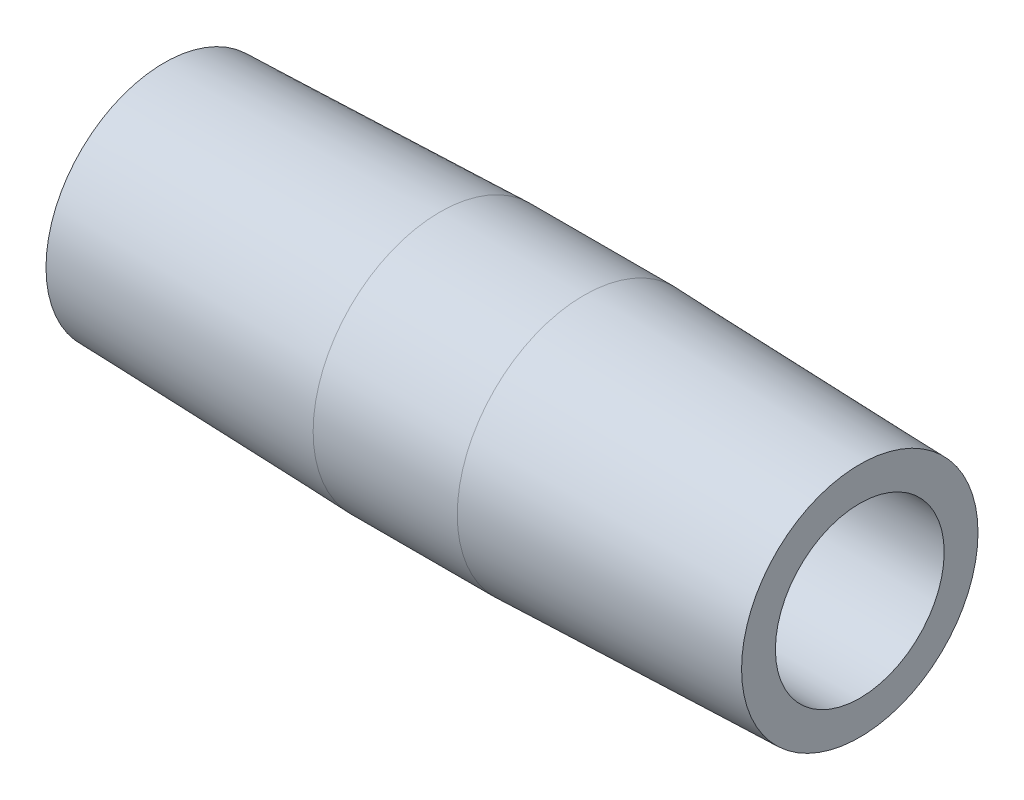
ISO-10303-21;
HEADER;
FILE_DESCRIPTION(('STEP AP214'),'2;1');
FILE_NAME('part.step','',(''),(''),'','','');
FILE_SCHEMA(('AUTOMOTIVE_DESIGN { 1 0 10303 214 1 1 1 1 }'));
ENDSEC;
DATA;
#1=APPLICATION_CONTEXT('core data for automotive mechanical design processes');
#2=APPLICATION_PROTOCOL_DEFINITION('international standard','automotive_design',2000,#1);
#3=PRODUCT_CONTEXT('',#1,'mechanical');
#4=PRODUCT('Part','Part','',(#3));
#5=PRODUCT_RELATED_PRODUCT_CATEGORY('part','',(#4));
#6=PRODUCT_DEFINITION_FORMATION('','',#4);
#7=PRODUCT_DEFINITION_CONTEXT('part definition',#1,'design');
#8=PRODUCT_DEFINITION('design','',#6,#7);
#9=PRODUCT_DEFINITION_SHAPE('','',#8);
#10=(LENGTH_UNIT() NAMED_UNIT(*) SI_UNIT(.MILLI.,.METRE.));
#11=(NAMED_UNIT(*) PLANE_ANGLE_UNIT() SI_UNIT($,.RADIAN.));
#12=(NAMED_UNIT(*) SI_UNIT($,.STERADIAN.) SOLID_ANGLE_UNIT());
#13=UNCERTAINTY_MEASURE_WITH_UNIT(LENGTH_MEASURE(1.E-05),#10,'distance_accuracy_value','');
#14=(GEOMETRIC_REPRESENTATION_CONTEXT(3) GLOBAL_UNCERTAINTY_ASSIGNED_CONTEXT((#13)) GLOBAL_UNIT_ASSIGNED_CONTEXT((#10,
#11,#12)) REPRESENTATION_CONTEXT('',''));
#15=CARTESIAN_POINT('',(0.,0.,0.));
#16=DIRECTION('',(0.,0.,1.));
#17=DIRECTION('',(1.,0.,0.));
#18=AXIS2_PLACEMENT_3D('',#15,#16,#17);
#19=CARTESIAN_POINT('',(0.,0.,0.));
#20=DIRECTION('',(1.,0.,0.));
#21=DIRECTION('',(0.,0.,-1.));
#22=AXIS2_PLACEMENT_3D('',#19,#20,#21);
#23=CYLINDRICAL_SURFACE('',#22,6.9453125);
#24=CARTESIAN_POINT('',(3.94716000000001,0.,0.));
#25=DIRECTION('',(-1.,0.,0.));
#26=DIRECTION('',(0.,0.,1.));
#27=AXIS2_PLACEMENT_3D('',#24,#25,#26);
#28=CIRCLE('',#27,6.9453125);
#29=CARTESIAN_POINT('',(3.94716000000001,0.,6.9453125));
#30=VERTEX_POINT('',#29);
#31=EDGE_CURVE('E42',#30,#30,#28,.T.);
#32=ORIENTED_EDGE('',*,*,#31,.T.);
#33=EDGE_LOOP('',(#32));
#34=FACE_BOUND('',#33,.T.);
#35=CARTESIAN_POINT('',(-3.94716000000001,0.,0.));
#36=DIRECTION('',(1.,0.,0.));
#37=DIRECTION('',(0.,0.,-1.));
#38=AXIS2_PLACEMENT_3D('',#35,#36,#37);
#39=CIRCLE('',#38,6.9453125);
#40=CARTESIAN_POINT('',(-3.94716000000001,0.,-6.9453125));
#41=VERTEX_POINT('',#40);
#42=EDGE_CURVE('E50',#41,#41,#39,.T.);
#43=ORIENTED_EDGE('',*,*,#42,.T.);
#44=EDGE_LOOP('',(#43));
#45=FACE_BOUND('',#44,.T.);
#46=ADVANCED_FACE('F35',(#34,#45),#23,.T.);
#47=CARTESIAN_POINT('',(3.94716000000001,0.,0.));
#48=DIRECTION('',(-1.,0.,0.));
#49=DIRECTION('',(0.,0.,-1.));
#50=AXIS2_PLACEMENT_3D('',#47,#48,#49);
#51=CONICAL_SURFACE('',#50,6.9453125,0.0311250383272323);
#52=CARTESIAN_POINT('',(19.05,0.,0.));
#53=DIRECTION('',(1.,0.,0.));
#54=DIRECTION('',(0.,0.,-1.));
#55=AXIS2_PLACEMENT_3D('',#52,#53,#54);
#56=CIRCLE('',#55,6.47508416895374);
#57=CARTESIAN_POINT('',(19.05,0.,-6.47508416895374));
#58=VERTEX_POINT('',#57);
#59=EDGE_CURVE('E10',#58,#58,#56,.T.);
#60=ORIENTED_EDGE('',*,*,#59,.F.);
#61=EDGE_LOOP('',(#60));
#62=FACE_BOUND('',#61,.T.);
#63=ORIENTED_EDGE('',*,*,#31,.F.);
#64=EDGE_LOOP('',(#63));
#65=FACE_BOUND('',#64,.T.);
#66=ADVANCED_FACE('F37',(#62,#65),#51,.T.);
#67=CARTESIAN_POINT('',(19.05,0.,0.));
#68=DIRECTION('',(1.,0.,0.));
#69=DIRECTION('',(0.,0.,-1.));
#70=AXIS2_PLACEMENT_3D('',#67,#68,#69);
#71=PLANE('',#70);
#72=CARTESIAN_POINT('',(19.05,0.,0.));
#73=DIRECTION('',(1.,0.,0.));
#74=DIRECTION('',(0.,0.,-1.));
#75=AXIS2_PLACEMENT_3D('',#72,#73,#74);
#76=CIRCLE('',#75,4.6228);
#77=CARTESIAN_POINT('',(19.05,0.,-4.6228));
#78=VERTEX_POINT('',#77);
#79=EDGE_CURVE('E56',#78,#78,#76,.T.);
#80=ORIENTED_EDGE('',*,*,#79,.F.);
#81=EDGE_LOOP('',(#80));
#82=FACE_BOUND('',#81,.T.);
#83=ORIENTED_EDGE('',*,*,#59,.T.);
#84=EDGE_LOOP('',(#83));
#85=FACE_BOUND('',#84,.T.);
#86=ADVANCED_FACE('F71',(#82,#85),#71,.T.);
#87=CARTESIAN_POINT('',(-3.94716000000001,0.,0.));
#88=DIRECTION('',(1.,0.,0.));
#89=DIRECTION('',(0.,0.,1.));
#90=AXIS2_PLACEMENT_3D('',#87,#88,#89);
#91=CONICAL_SURFACE('',#90,6.9453125,0.0311250383272323);
#92=CARTESIAN_POINT('',(-19.05,0.,0.));
#93=DIRECTION('',(-1.,0.,0.));
#94=DIRECTION('',(0.,0.,1.));
#95=AXIS2_PLACEMENT_3D('',#92,#93,#94);
#96=CIRCLE('',#95,6.47508416895374);
#97=CARTESIAN_POINT('',(-19.05,0.,6.47508416895374));
#98=VERTEX_POINT('',#97);
#99=EDGE_CURVE('E46',#98,#98,#96,.T.);
#100=ORIENTED_EDGE('',*,*,#99,.F.);
#101=EDGE_LOOP('',(#100));
#102=FACE_BOUND('',#101,.T.);
#103=ORIENTED_EDGE('',*,*,#42,.F.);
#104=EDGE_LOOP('',(#103));
#105=FACE_BOUND('',#104,.T.);
#106=ADVANCED_FACE('F73',(#102,#105),#91,.T.);
#107=CARTESIAN_POINT('',(-19.05,0.,0.));
#108=DIRECTION('',(-1.,0.,0.));
#109=DIRECTION('',(0.,0.,1.));
#110=AXIS2_PLACEMENT_3D('',#107,#108,#109);
#111=PLANE('',#110);
#112=CARTESIAN_POINT('',(-19.05,0.,0.));
#113=DIRECTION('',(1.,0.,0.));
#114=DIRECTION('',(0.,0.,-1.));
#115=AXIS2_PLACEMENT_3D('',#112,#113,#114);
#116=CIRCLE('',#115,4.6228);
#117=CARTESIAN_POINT('',(-19.05,0.,-4.6228));
#118=VERTEX_POINT('',#117);
#119=EDGE_CURVE('E55',#118,#118,#116,.T.);
#120=ORIENTED_EDGE('',*,*,#119,.T.);
#121=EDGE_LOOP('',(#120));
#122=FACE_BOUND('',#121,.T.);
#123=ORIENTED_EDGE('',*,*,#99,.T.);
#124=EDGE_LOOP('',(#123));
#125=FACE_BOUND('',#124,.T.);
#126=ADVANCED_FACE('F62',(#122,#125),#111,.T.);
#127=CARTESIAN_POINT('',(-19.05,0.,0.));
#128=DIRECTION('',(1.,0.,0.));
#129=DIRECTION('',(0.,0.,-1.));
#130=AXIS2_PLACEMENT_3D('',#127,#128,#129);
#131=CYLINDRICAL_SURFACE('',#130,4.6228);
#132=ORIENTED_EDGE('',*,*,#119,.F.);
#133=EDGE_LOOP('',(#132));
#134=FACE_BOUND('',#133,.T.);
#135=ORIENTED_EDGE('',*,*,#79,.T.);
#136=EDGE_LOOP('',(#135));
#137=FACE_BOUND('',#136,.T.);
#138=ADVANCED_FACE('F65',(#134,#137),#131,.F.);
#139=CLOSED_SHELL('',(#46,#66,#86,#106,#126,#138));
#140=MANIFOLD_SOLID_BREP('B2',#139);
#141=ADVANCED_BREP_SHAPE_REPRESENTATION('',(#18,#140),#14);
#142=SHAPE_DEFINITION_REPRESENTATION(#9,#141);
ENDSEC;
END-ISO-10303-21;
